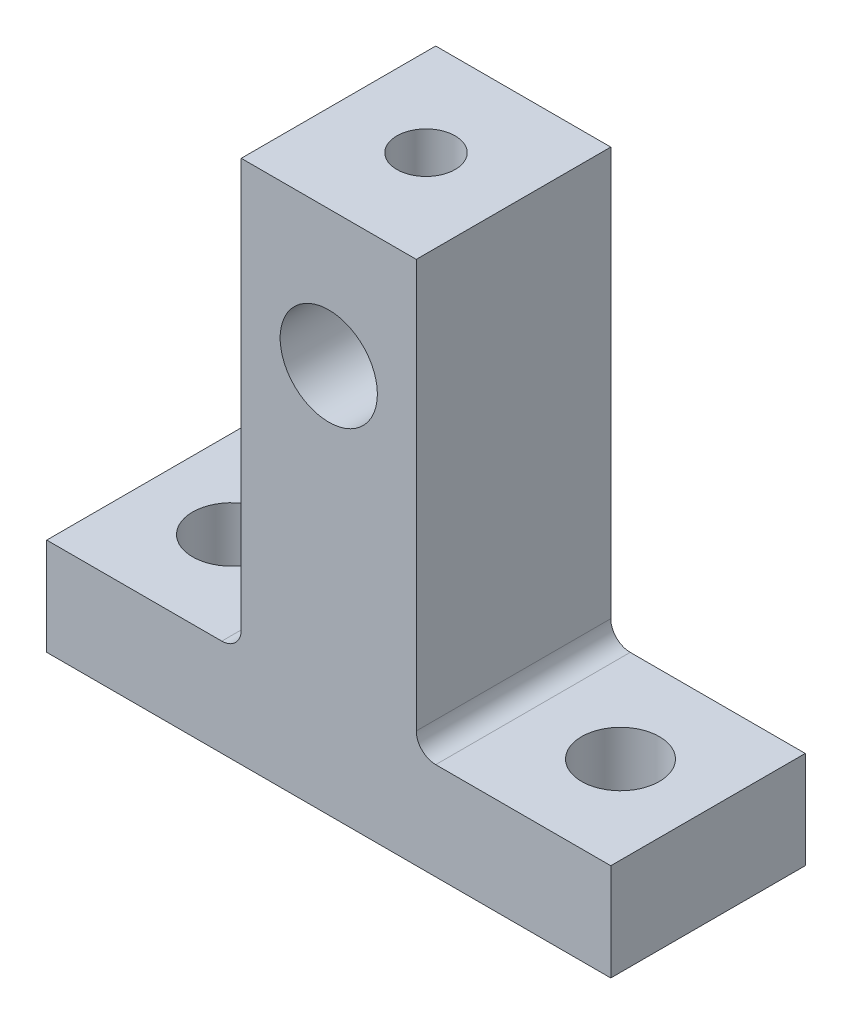
ISO-10303-21;
HEADER;
FILE_DESCRIPTION(('STEP AP214'),'2;1');
FILE_NAME('part.step','',(''),(''),'','','');
FILE_SCHEMA(('AUTOMOTIVE_DESIGN { 1 0 10303 214 1 1 1 1 }'));
ENDSEC;
DATA;
#1=APPLICATION_CONTEXT('core data for automotive mechanical design processes');
#2=APPLICATION_PROTOCOL_DEFINITION('international standard','automotive_design',2000,#1);
#3=PRODUCT_CONTEXT('',#1,'mechanical');
#4=PRODUCT('Part','Part','',(#3));
#5=PRODUCT_RELATED_PRODUCT_CATEGORY('part','',(#4));
#6=PRODUCT_DEFINITION_FORMATION('','',#4);
#7=PRODUCT_DEFINITION_CONTEXT('part definition',#1,'design');
#8=PRODUCT_DEFINITION('design','',#6,#7);
#9=PRODUCT_DEFINITION_SHAPE('','',#8);
#10=(LENGTH_UNIT() NAMED_UNIT(*) SI_UNIT(.MILLI.,.METRE.));
#11=(NAMED_UNIT(*) PLANE_ANGLE_UNIT() SI_UNIT($,.RADIAN.));
#12=(NAMED_UNIT(*) SI_UNIT($,.STERADIAN.) SOLID_ANGLE_UNIT());
#13=UNCERTAINTY_MEASURE_WITH_UNIT(LENGTH_MEASURE(1.E-05),#10,'distance_accuracy_value','');
#14=(GEOMETRIC_REPRESENTATION_CONTEXT(3) GLOBAL_UNCERTAINTY_ASSIGNED_CONTEXT((#13)) GLOBAL_UNIT_ASSIGNED_CONTEXT((#10,
#11,#12)) REPRESENTATION_CONTEXT('',''));
#15=CARTESIAN_POINT('',(0.,0.,0.));
#16=DIRECTION('',(0.,0.,1.));
#17=DIRECTION('',(1.,0.,0.));
#18=AXIS2_PLACEMENT_3D('',#15,#16,#17);
#19=CARTESIAN_POINT('',(20.,6.,5.));
#20=DIRECTION('',(0.,0.,-1.));
#21=DIRECTION('',(-1.,0.,0.));
#22=AXIS2_PLACEMENT_3D('',#19,#20,#21);
#23=PLANE('',#22);
#24=DIRECTION('',(0.,-1.,0.));
#25=VECTOR('',#24,1.);
#26=CARTESIAN_POINT('',(0.,5.,5.));
#27=LINE('',#26,#25);
#28=CARTESIAN_POINT('',(0.,5.,5.));
#29=VERTEX_POINT('',#28);
#30=CARTESIAN_POINT('',(0.,0.,5.));
#31=VERTEX_POINT('',#30);
#32=EDGE_CURVE('E165',#29,#31,#27,.T.);
#33=ORIENTED_EDGE('',*,*,#32,.T.);
#34=DIRECTION('',(1.,0.,0.));
#35=VECTOR('',#34,1.);
#36=CARTESIAN_POINT('',(0.,0.,5.));
#37=LINE('',#36,#35);
#38=CARTESIAN_POINT('',(29.,0.,5.));
#39=VERTEX_POINT('',#38);
#40=EDGE_CURVE('E103',#31,#39,#37,.T.);
#41=ORIENTED_EDGE('',*,*,#40,.T.);
#42=DIRECTION('',(0.,1.,0.));
#43=VECTOR('',#42,1.);
#44=CARTESIAN_POINT('',(29.,0.,5.));
#45=LINE('',#44,#43);
#46=CARTESIAN_POINT('',(29.,5.,5.));
#47=VERTEX_POINT('',#46);
#48=EDGE_CURVE('E186',#39,#47,#45,.T.);
#49=ORIENTED_EDGE('',*,*,#48,.T.);
#50=DIRECTION('',(-1.,0.,0.));
#51=VECTOR('',#50,1.);
#52=CARTESIAN_POINT('',(29.,5.,5.));
#53=LINE('',#52,#51);
#54=CARTESIAN_POINT('',(20.,5.,5.));
#55=VERTEX_POINT('',#54);
#56=EDGE_CURVE('E205',#47,#55,#53,.T.);
#57=ORIENTED_EDGE('',*,*,#56,.T.);
#58=CARTESIAN_POINT('',(20.,6.,5.));
#59=DIRECTION('',(0.,0.,-1.));
#60=DIRECTION('',(-1.,0.,0.));
#61=AXIS2_PLACEMENT_3D('',#58,#59,#60);
#62=CIRCLE('',#61,1.);
#63=CARTESIAN_POINT('',(19.,6.,5.));
#64=VERTEX_POINT('',#63);
#65=EDGE_CURVE('E202',#55,#64,#62,.T.);
#66=ORIENTED_EDGE('',*,*,#65,.T.);
#67=DIRECTION('',(0.,1.,0.));
#68=VECTOR('',#67,1.);
#69=CARTESIAN_POINT('',(19.,6.00000000000001,5.));
#70=LINE('',#69,#68);
#71=CARTESIAN_POINT('',(19.,27.,5.));
#72=VERTEX_POINT('',#71);
#73=EDGE_CURVE('E204',#64,#72,#70,.T.);
#74=ORIENTED_EDGE('',*,*,#73,.T.);
#75=DIRECTION('',(-1.,0.,0.));
#76=VECTOR('',#75,1.);
#77=CARTESIAN_POINT('',(19.,27.,5.));
#78=LINE('',#77,#76);
#79=CARTESIAN_POINT('',(10.,27.,5.));
#80=VERTEX_POINT('',#79);
#81=EDGE_CURVE('E128',#72,#80,#78,.T.);
#82=ORIENTED_EDGE('',*,*,#81,.T.);
#83=DIRECTION('',(0.,-1.,0.));
#84=VECTOR('',#83,1.);
#85=CARTESIAN_POINT('',(10.,27.,5.));
#86=LINE('',#85,#84);
#87=CARTESIAN_POINT('',(10.,6.00000000000001,5.));
#88=VERTEX_POINT('',#87);
#89=EDGE_CURVE('E122',#80,#88,#86,.T.);
#90=ORIENTED_EDGE('',*,*,#89,.T.);
#91=CARTESIAN_POINT('',(9.,6.,5.));
#92=DIRECTION('',(0.,0.,-1.));
#93=DIRECTION('',(-1.,0.,0.));
#94=AXIS2_PLACEMENT_3D('',#91,#92,#93);
#95=CIRCLE('',#94,1.);
#96=CARTESIAN_POINT('',(8.99999999999999,5.,5.));
#97=VERTEX_POINT('',#96);
#98=EDGE_CURVE('E126',#88,#97,#95,.T.);
#99=ORIENTED_EDGE('',*,*,#98,.T.);
#100=DIRECTION('',(-1.,0.,0.));
#101=VECTOR('',#100,1.);
#102=CARTESIAN_POINT('',(8.99999999999999,5.,5.));
#103=LINE('',#102,#101);
#104=EDGE_CURVE('E54',#97,#29,#103,.T.);
#105=ORIENTED_EDGE('',*,*,#104,.T.);
#106=EDGE_LOOP('',(#33,#41,#49,#57,#66,#74,#82,#90,#99,#105));
#107=FACE_BOUND('',#106,.T.);
#108=CARTESIAN_POINT('',(14.5,20.,5.));
#109=DIRECTION('',(0.,0.,1.));
#110=DIRECTION('',(1.,0.,0.));
#111=AXIS2_PLACEMENT_3D('',#108,#109,#110);
#112=CIRCLE('',#111,2.5);
#113=CARTESIAN_POINT('',(17.,20.,5.));
#114=VERTEX_POINT('',#113);
#115=EDGE_CURVE('E150',#114,#114,#112,.T.);
#116=ORIENTED_EDGE('',*,*,#115,.F.);
#117=EDGE_LOOP('',(#116));
#118=FACE_BOUND('',#117,.T.);
#119=ADVANCED_FACE('F37',(#107,#118),#23,.F.);
#120=CARTESIAN_POINT('',(20.,6.,-5.));
#121=DIRECTION('',(0.,0.,-1.));
#122=DIRECTION('',(-1.,0.,0.));
#123=AXIS2_PLACEMENT_3D('',#120,#121,#122);
#124=PLANE('',#123);
#125=DIRECTION('',(0.,-1.,0.));
#126=VECTOR('',#125,1.);
#127=CARTESIAN_POINT('',(0.,5.,-5.));
#128=LINE('',#127,#126);
#129=CARTESIAN_POINT('',(0.,5.,-5.));
#130=VERTEX_POINT('',#129);
#131=CARTESIAN_POINT('',(0.,0.,-5.));
#132=VERTEX_POINT('',#131);
#133=EDGE_CURVE('E146',#130,#132,#128,.T.);
#134=ORIENTED_EDGE('',*,*,#133,.F.);
#135=DIRECTION('',(-1.,0.,0.));
#136=VECTOR('',#135,1.);
#137=CARTESIAN_POINT('',(8.99999999999999,5.,-5.));
#138=LINE('',#137,#136);
#139=CARTESIAN_POINT('',(8.99999999999999,5.,-5.));
#140=VERTEX_POINT('',#139);
#141=EDGE_CURVE('E95',#140,#130,#138,.T.);
#142=ORIENTED_EDGE('',*,*,#141,.F.);
#143=CARTESIAN_POINT('',(9.,6.,-5.));
#144=DIRECTION('',(0.,0.,-1.));
#145=DIRECTION('',(-1.,0.,0.));
#146=AXIS2_PLACEMENT_3D('',#143,#144,#145);
#147=CIRCLE('',#146,1.);
#148=CARTESIAN_POINT('',(10.,6.00000000000001,-5.));
#149=VERTEX_POINT('',#148);
#150=EDGE_CURVE('E89',#149,#140,#147,.T.);
#151=ORIENTED_EDGE('',*,*,#150,.F.);
#152=DIRECTION('',(0.,-1.,0.));
#153=VECTOR('',#152,1.);
#154=CARTESIAN_POINT('',(10.,27.,-5.));
#155=LINE('',#154,#153);
#156=CARTESIAN_POINT('',(10.,27.,-5.));
#157=VERTEX_POINT('',#156);
#158=EDGE_CURVE('E136',#157,#149,#155,.T.);
#159=ORIENTED_EDGE('',*,*,#158,.F.);
#160=DIRECTION('',(-1.,0.,0.));
#161=VECTOR('',#160,1.);
#162=CARTESIAN_POINT('',(19.,27.,-5.));
#163=LINE('',#162,#161);
#164=CARTESIAN_POINT('',(19.,27.,-5.));
#165=VERTEX_POINT('',#164);
#166=EDGE_CURVE('E160',#165,#157,#163,.T.);
#167=ORIENTED_EDGE('',*,*,#166,.F.);
#168=DIRECTION('',(0.,1.,0.));
#169=VECTOR('',#168,1.);
#170=CARTESIAN_POINT('',(19.,6.00000000000001,-5.));
#171=LINE('',#170,#169);
#172=CARTESIAN_POINT('',(19.,6.,-5.));
#173=VERTEX_POINT('',#172);
#174=EDGE_CURVE('E158',#173,#165,#171,.T.);
#175=ORIENTED_EDGE('',*,*,#174,.F.);
#176=CARTESIAN_POINT('',(20.,6.,-5.));
#177=DIRECTION('',(0.,0.,-1.));
#178=DIRECTION('',(-1.,0.,0.));
#179=AXIS2_PLACEMENT_3D('',#176,#177,#178);
#180=CIRCLE('',#179,1.);
#181=CARTESIAN_POINT('',(20.,5.,-5.));
#182=VERTEX_POINT('',#181);
#183=EDGE_CURVE('E156',#182,#173,#180,.T.);
#184=ORIENTED_EDGE('',*,*,#183,.F.);
#185=DIRECTION('',(-1.,0.,0.));
#186=VECTOR('',#185,1.);
#187=CARTESIAN_POINT('',(29.,5.,-5.));
#188=LINE('',#187,#186);
#189=CARTESIAN_POINT('',(29.,5.,-5.));
#190=VERTEX_POINT('',#189);
#191=EDGE_CURVE('E154',#190,#182,#188,.T.);
#192=ORIENTED_EDGE('',*,*,#191,.F.);
#193=DIRECTION('',(0.,1.,0.));
#194=VECTOR('',#193,1.);
#195=CARTESIAN_POINT('',(29.,0.,-5.));
#196=LINE('',#195,#194);
#197=CARTESIAN_POINT('',(29.,0.,-5.));
#198=VERTEX_POINT('',#197);
#199=EDGE_CURVE('E152',#198,#190,#196,.T.);
#200=ORIENTED_EDGE('',*,*,#199,.F.);
#201=DIRECTION('',(1.,0.,0.));
#202=VECTOR('',#201,1.);
#203=CARTESIAN_POINT('',(0.,0.,-5.));
#204=LINE('',#203,#202);
#205=EDGE_CURVE('E149',#132,#198,#204,.T.);
#206=ORIENTED_EDGE('',*,*,#205,.F.);
#207=EDGE_LOOP('',(#134,#142,#151,#159,#167,#175,#184,#192,#200,#206));
#208=FACE_BOUND('',#207,.T.);
#209=CARTESIAN_POINT('',(14.5,20.,-5.));
#210=DIRECTION('',(0.,0.,1.));
#211=DIRECTION('',(1.,0.,0.));
#212=AXIS2_PLACEMENT_3D('',#209,#210,#211);
#213=CIRCLE('',#212,2.5);
#214=CARTESIAN_POINT('',(17.,20.,-5.));
#215=VERTEX_POINT('',#214);
#216=EDGE_CURVE('E213',#215,#215,#213,.T.);
#217=ORIENTED_EDGE('',*,*,#216,.T.);
#218=EDGE_LOOP('',(#217));
#219=FACE_BOUND('',#218,.T.);
#220=ADVANCED_FACE('F190',(#208,#219),#124,.T.);
#221=CARTESIAN_POINT('',(0.,5.,5.));
#222=DIRECTION('',(1.,0.,0.));
#223=DIRECTION('',(0.,1.,0.));
#224=AXIS2_PLACEMENT_3D('',#221,#222,#223);
#225=PLANE('',#224);
#226=ORIENTED_EDGE('',*,*,#133,.T.);
#227=DIRECTION('',(0.,0.,-1.));
#228=VECTOR('',#227,1.);
#229=CARTESIAN_POINT('',(0.,0.,5.));
#230=LINE('',#229,#228);
#231=EDGE_CURVE('E11',#31,#132,#230,.T.);
#232=ORIENTED_EDGE('',*,*,#231,.F.);
#233=ORIENTED_EDGE('',*,*,#32,.F.);
#234=DIRECTION('',(0.,0.,-1.));
#235=VECTOR('',#234,1.);
#236=CARTESIAN_POINT('',(0.,5.,5.));
#237=LINE('',#236,#235);
#238=EDGE_CURVE('E142',#29,#130,#237,.T.);
#239=ORIENTED_EDGE('',*,*,#238,.T.);
#240=EDGE_LOOP('',(#226,#232,#233,#239));
#241=FACE_BOUND('',#240,.T.);
#242=ADVANCED_FACE('F39',(#241),#225,.F.);
#243=CARTESIAN_POINT('',(0.,0.,5.));
#244=DIRECTION('',(0.,1.,0.));
#245=DIRECTION('',(-1.,0.,0.));
#246=AXIS2_PLACEMENT_3D('',#243,#244,#245);
#247=PLANE('',#246);
#248=CARTESIAN_POINT('',(4.5,0.,0.));
#249=DIRECTION('',(0.,1.,0.));
#250=DIRECTION('',(-1.,0.,0.));
#251=AXIS2_PLACEMENT_3D('',#248,#249,#250);
#252=CIRCLE('',#251,2.);
#253=CARTESIAN_POINT('',(2.5,0.,0.));
#254=VERTEX_POINT('',#253);
#255=EDGE_CURVE('E285',#254,#254,#252,.T.);
#256=ORIENTED_EDGE('',*,*,#255,.T.);
#257=EDGE_LOOP('',(#256));
#258=FACE_BOUND('',#257,.T.);
#259=CARTESIAN_POINT('',(24.5,0.,0.));
#260=DIRECTION('',(0.,1.,0.));
#261=DIRECTION('',(-1.,0.,0.));
#262=AXIS2_PLACEMENT_3D('',#259,#260,#261);
#263=CIRCLE('',#262,2.);
#264=CARTESIAN_POINT('',(22.5,0.,0.));
#265=VERTEX_POINT('',#264);
#266=EDGE_CURVE('E288',#265,#265,#263,.T.);
#267=ORIENTED_EDGE('',*,*,#266,.T.);
#268=EDGE_LOOP('',(#267));
#269=FACE_BOUND('',#268,.T.);
#270=ORIENTED_EDGE('',*,*,#205,.T.);
#271=DIRECTION('',(0.,0.,-1.));
#272=VECTOR('',#271,1.);
#273=CARTESIAN_POINT('',(29.,0.,5.));
#274=LINE('',#273,#272);
#275=EDGE_CURVE('E46',#39,#198,#274,.T.);
#276=ORIENTED_EDGE('',*,*,#275,.F.);
#277=ORIENTED_EDGE('',*,*,#40,.F.);
#278=ORIENTED_EDGE('',*,*,#231,.T.);
#279=EDGE_LOOP('',(#270,#276,#277,#278));
#280=FACE_BOUND('',#279,.T.);
#281=ADVANCED_FACE('F276',(#258,#269,#280),#247,.F.);
#282=CARTESIAN_POINT('',(29.,0.,5.));
#283=DIRECTION('',(-1.,0.,0.));
#284=DIRECTION('',(0.,0.,1.));
#285=AXIS2_PLACEMENT_3D('',#282,#283,#284);
#286=PLANE('',#285);
#287=ORIENTED_EDGE('',*,*,#199,.T.);
#288=DIRECTION('',(0.,0.,-1.));
#289=VECTOR('',#288,1.);
#290=CARTESIAN_POINT('',(29.,5.,5.));
#291=LINE('',#290,#289);
#292=EDGE_CURVE('E178',#47,#190,#291,.T.);
#293=ORIENTED_EDGE('',*,*,#292,.F.);
#294=ORIENTED_EDGE('',*,*,#48,.F.);
#295=ORIENTED_EDGE('',*,*,#275,.T.);
#296=EDGE_LOOP('',(#287,#293,#294,#295));
#297=FACE_BOUND('',#296,.T.);
#298=ADVANCED_FACE('F184',(#297),#286,.F.);
#299=CARTESIAN_POINT('',(29.,5.,5.));
#300=DIRECTION('',(0.,-1.,0.));
#301=DIRECTION('',(1.,0.,0.));
#302=AXIS2_PLACEMENT_3D('',#299,#300,#301);
#303=PLANE('',#302);
#304=CARTESIAN_POINT('',(24.5,5.,0.));
#305=DIRECTION('',(0.,1.,0.));
#306=DIRECTION('',(-1.,0.,0.));
#307=AXIS2_PLACEMENT_3D('',#304,#305,#306);
#308=CIRCLE('',#307,2.);
#309=CARTESIAN_POINT('',(22.5,5.,0.));
#310=VERTEX_POINT('',#309);
#311=EDGE_CURVE('E295',#310,#310,#308,.T.);
#312=ORIENTED_EDGE('',*,*,#311,.F.);
#313=EDGE_LOOP('',(#312));
#314=FACE_BOUND('',#313,.T.);
#315=ORIENTED_EDGE('',*,*,#191,.T.);
#316=DIRECTION('',(0.,0.,-1.));
#317=VECTOR('',#316,1.);
#318=CARTESIAN_POINT('',(20.,5.,5.));
#319=LINE('',#318,#317);
#320=EDGE_CURVE('E175',#55,#182,#319,.T.);
#321=ORIENTED_EDGE('',*,*,#320,.F.);
#322=ORIENTED_EDGE('',*,*,#56,.F.);
#323=ORIENTED_EDGE('',*,*,#292,.T.);
#324=EDGE_LOOP('',(#315,#321,#322,#323));
#325=FACE_BOUND('',#324,.T.);
#326=ADVANCED_FACE('F196',(#314,#325),#303,.F.);
#327=CARTESIAN_POINT('',(20.,6.,5.));
#328=DIRECTION('',(0.,0.,-1.));
#329=DIRECTION('',(-1.,0.,0.));
#330=AXIS2_PLACEMENT_3D('',#327,#328,#329);
#331=CYLINDRICAL_SURFACE('',#330,1.);
#332=ORIENTED_EDGE('',*,*,#183,.T.);
#333=DIRECTION('',(0.,0.,-1.));
#334=VECTOR('',#333,1.);
#335=CARTESIAN_POINT('',(19.,6.,5.));
#336=LINE('',#335,#334);
#337=EDGE_CURVE('E172',#64,#173,#336,.T.);
#338=ORIENTED_EDGE('',*,*,#337,.F.);
#339=ORIENTED_EDGE('',*,*,#65,.F.);
#340=ORIENTED_EDGE('',*,*,#320,.T.);
#341=EDGE_LOOP('',(#332,#338,#339,#340));
#342=FACE_BOUND('',#341,.T.);
#343=ADVANCED_FACE('F200',(#342),#331,.F.);
#344=CARTESIAN_POINT('',(19.,6.00000000000001,5.));
#345=DIRECTION('',(-1.,0.,0.));
#346=DIRECTION('',(0.,-1.,0.));
#347=AXIS2_PLACEMENT_3D('',#344,#345,#346);
#348=PLANE('',#347);
#349=ORIENTED_EDGE('',*,*,#174,.T.);
#350=DIRECTION('',(0.,0.,-1.));
#351=VECTOR('',#350,1.);
#352=CARTESIAN_POINT('',(19.,27.,5.));
#353=LINE('',#352,#351);
#354=EDGE_CURVE('E169',#72,#165,#353,.T.);
#355=ORIENTED_EDGE('',*,*,#354,.F.);
#356=ORIENTED_EDGE('',*,*,#73,.F.);
#357=ORIENTED_EDGE('',*,*,#337,.T.);
#358=EDGE_LOOP('',(#349,#355,#356,#357));
#359=FACE_BOUND('',#358,.T.);
#360=ADVANCED_FACE('F265',(#359),#348,.F.);
#361=CARTESIAN_POINT('',(19.,27.,5.));
#362=DIRECTION('',(0.,-1.,0.));
#363=DIRECTION('',(0.,0.,-1.));
#364=AXIS2_PLACEMENT_3D('',#361,#362,#363);
#365=PLANE('',#364);
#366=CARTESIAN_POINT('',(14.5,27.,0.));
#367=DIRECTION('',(0.,1.,0.));
#368=DIRECTION('',(0.,0.,1.));
#369=AXIS2_PLACEMENT_3D('',#366,#367,#368);
#370=CIRCLE('',#369,1.5);
#371=CARTESIAN_POINT('',(14.5,27.,1.5));
#372=VERTEX_POINT('',#371);
#373=EDGE_CURVE('E226',#372,#372,#370,.T.);
#374=ORIENTED_EDGE('',*,*,#373,.F.);
#375=EDGE_LOOP('',(#374));
#376=FACE_BOUND('',#375,.T.);
#377=ORIENTED_EDGE('',*,*,#166,.T.);
#378=DIRECTION('',(0.,0.,-1.));
#379=VECTOR('',#378,1.);
#380=CARTESIAN_POINT('',(10.,27.,5.));
#381=LINE('',#380,#379);
#382=EDGE_CURVE('E137',#80,#157,#381,.T.);
#383=ORIENTED_EDGE('',*,*,#382,.F.);
#384=ORIENTED_EDGE('',*,*,#81,.F.);
#385=ORIENTED_EDGE('',*,*,#354,.T.);
#386=EDGE_LOOP('',(#377,#383,#384,#385));
#387=FACE_BOUND('',#386,.T.);
#388=ADVANCED_FACE('F262',(#376,#387),#365,.F.);
#389=CARTESIAN_POINT('',(10.,27.,5.));
#390=DIRECTION('',(1.,0.,0.));
#391=DIRECTION('',(0.,1.,0.));
#392=AXIS2_PLACEMENT_3D('',#389,#390,#391);
#393=PLANE('',#392);
#394=ORIENTED_EDGE('',*,*,#158,.T.);
#395=DIRECTION('',(0.,0.,-1.));
#396=VECTOR('',#395,1.);
#397=CARTESIAN_POINT('',(10.,6.00000000000001,5.));
#398=LINE('',#397,#396);
#399=EDGE_CURVE('E133',#88,#149,#398,.T.);
#400=ORIENTED_EDGE('',*,*,#399,.F.);
#401=ORIENTED_EDGE('',*,*,#89,.F.);
#402=ORIENTED_EDGE('',*,*,#382,.T.);
#403=EDGE_LOOP('',(#394,#400,#401,#402));
#404=FACE_BOUND('',#403,.T.);
#405=ADVANCED_FACE('F134',(#404),#393,.F.);
#406=CARTESIAN_POINT('',(9.,6.,5.));
#407=DIRECTION('',(0.,0.,-1.));
#408=DIRECTION('',(-1.,0.,0.));
#409=AXIS2_PLACEMENT_3D('',#406,#407,#408);
#410=CYLINDRICAL_SURFACE('',#409,1.);
#411=ORIENTED_EDGE('',*,*,#150,.T.);
#412=DIRECTION('',(0.,0.,-1.));
#413=VECTOR('',#412,1.);
#414=CARTESIAN_POINT('',(8.99999999999999,5.,5.));
#415=LINE('',#414,#413);
#416=EDGE_CURVE('E138',#97,#140,#415,.T.);
#417=ORIENTED_EDGE('',*,*,#416,.F.);
#418=ORIENTED_EDGE('',*,*,#98,.F.);
#419=ORIENTED_EDGE('',*,*,#399,.T.);
#420=EDGE_LOOP('',(#411,#417,#418,#419));
#421=FACE_BOUND('',#420,.T.);
#422=ADVANCED_FACE('F140',(#421),#410,.F.);
#423=CARTESIAN_POINT('',(8.99999999999999,5.,5.));
#424=DIRECTION('',(0.,-1.,0.));
#425=DIRECTION('',(1.,0.,0.));
#426=AXIS2_PLACEMENT_3D('',#423,#424,#425);
#427=PLANE('',#426);
#428=CARTESIAN_POINT('',(4.5,5.,0.));
#429=DIRECTION('',(0.,1.,0.));
#430=DIRECTION('',(-1.,0.,0.));
#431=AXIS2_PLACEMENT_3D('',#428,#429,#430);
#432=CIRCLE('',#431,2.);
#433=CARTESIAN_POINT('',(2.5,5.,0.));
#434=VERTEX_POINT('',#433);
#435=EDGE_CURVE('E294',#434,#434,#432,.T.);
#436=ORIENTED_EDGE('',*,*,#435,.F.);
#437=EDGE_LOOP('',(#436));
#438=FACE_BOUND('',#437,.T.);
#439=ORIENTED_EDGE('',*,*,#141,.T.);
#440=ORIENTED_EDGE('',*,*,#238,.F.);
#441=ORIENTED_EDGE('',*,*,#104,.F.);
#442=ORIENTED_EDGE('',*,*,#416,.T.);
#443=EDGE_LOOP('',(#439,#440,#441,#442));
#444=FACE_BOUND('',#443,.T.);
#445=ADVANCED_FACE('F254',(#438,#444),#427,.F.);
#446=CARTESIAN_POINT('',(14.5,20.,5.));
#447=DIRECTION('',(0.,0.,-1.));
#448=DIRECTION('',(-1.,0.,0.));
#449=AXIS2_PLACEMENT_3D('',#446,#447,#448);
#450=CYLINDRICAL_SURFACE('',#449,2.5);
#451=CARTESIAN_POINT('',(14.5,22.5,1.5));
#452=CARTESIAN_POINT('',(14.576729833462,22.4999962578973,1.49999590899012));
#453=CARTESIAN_POINT('',(14.6535823206442,22.4964290461501,1.49407132907374));
#454=CARTESIAN_POINT('',(14.8049755095307,22.4824990360857,1.47067568048467));
#455=CARTESIAN_POINT('',(14.879510034596,22.4721194803272,1.45317613814578));
#456=CARTESIAN_POINT('',(15.0237518277908,22.4456155805449,1.40761363883314));
#457=CARTESIAN_POINT('',(15.0934810282266,22.4295197327294,1.37960304183684));
#458=CARTESIAN_POINT('',(15.2270303182147,22.3929536762641,1.31413966685897));
#459=CARTESIAN_POINT('',(15.2908518694164,22.3724845538025,1.27668923303126));
#460=CARTESIAN_POINT('',(15.4162992789993,22.3270536071909,1.19022517329142));
#461=CARTESIAN_POINT('',(15.4773840200814,22.3018679219598,1.14054630464861));
#462=CARTESIAN_POINT('',(15.5908827041189,22.2503043927963,1.03253279617173));
#463=CARTESIAN_POINT('',(15.6432853494811,22.2239250515357,0.974187062812685));
#464=CARTESIAN_POINT('',(15.7444499676297,22.1691106699591,0.842076489503271));
#465=CARTESIAN_POINT('',(15.7919776637881,22.1408201770365,0.767298229018715));
#466=CARTESIAN_POINT('',(15.873614377649,22.0893830141212,0.609153426756889));
#467=CARTESIAN_POINT('',(15.9077451733516,22.0662280227394,0.525801103752434));
#468=CARTESIAN_POINT('',(15.9544060171422,22.0335462966093,0.373403549346762));
#469=CARTESIAN_POINT('',(15.9701619724683,22.0220788313759,0.305764001389686));
#470=CARTESIAN_POINT('',(15.9921617234047,22.005903082955,0.168196284169639));
#471=CARTESIAN_POINT('',(15.9984173455683,22.0011863964376,0.0982710712455087));
#472=CARTESIAN_POINT('',(16.0010550879601,21.9992092246386,-0.0420114942173333));
#473=CARTESIAN_POINT('',(15.9974178340842,22.0019633701272,-0.112369425093195));
#474=CARTESIAN_POINT('',(15.9804606047883,22.0145326144374,-0.251278775427585));
#475=CARTESIAN_POINT('',(15.967133346201,22.0243530243223,-0.319828795847442));
#476=CARTESIAN_POINT('',(15.9317392188179,22.0495318694426,-0.452530242128104));
#477=CARTESIAN_POINT('',(15.9097874866609,22.0648171165254,-0.516727053924481));
#478=CARTESIAN_POINT('',(15.8579506177084,22.0992705135083,-0.640694990928121));
#479=CARTESIAN_POINT('',(15.828062572597,22.1184400862346,-0.700464483423924));
#480=CARTESIAN_POINT('',(15.7551798318458,22.1625532726899,-0.824984097122801));
#481=CARTESIAN_POINT('',(15.7108072439772,22.1879204337299,-0.888778092954925));
#482=CARTESIAN_POINT('',(15.61291092784,22.2393059976438,-1.00867648366701));
#483=CARTESIAN_POINT('',(15.5593784510058,22.2653250026215,-1.0647734339765));
#484=CARTESIAN_POINT('',(15.435811834383,22.3193550495832,-1.17561298182176));
#485=CARTESIAN_POINT('',(15.364517682705,22.3471383626853,-1.22907730601599));
#486=CARTESIAN_POINT('',(15.212276050459,22.3977242843398,-1.32312204719791));
#487=CARTESIAN_POINT('',(15.1313337639436,22.4205295542552,-1.36370935378995));
#488=CARTESIAN_POINT('',(14.9671975852682,22.4573039206615,-1.4279321827959));
#489=CARTESIAN_POINT('',(14.8844676241736,22.471739574397,-1.45247535571591));
#490=CARTESIAN_POINT('',(14.7150478951446,22.4921884281355,-1.48701119740538));
#491=CARTESIAN_POINT('',(14.6283630056613,22.4982117295274,-1.49702131775358));
#492=CARTESIAN_POINT('',(14.4662853856226,22.5009057037461,-1.50150784767831));
#493=CARTESIAN_POINT('',(14.3909575265813,22.4987352171429,-1.49790885508517));
#494=CARTESIAN_POINT('',(14.2421705980139,22.4877871208705,-1.47957414692808));
#495=CARTESIAN_POINT('',(14.1687114906239,22.4790096451804,-1.46483865719419));
#496=CARTESIAN_POINT('',(14.0274250678424,22.4559479244219,-1.42545656718754));
#497=CARTESIAN_POINT('',(13.9595042490715,22.4418027566256,-1.40105965092653));
#498=CARTESIAN_POINT('',(13.8287342509127,22.4091388086284,-1.34332262363473));
#499=CARTESIAN_POINT('',(13.7658860750361,22.3906191658651,-1.30998074865333));
#500=CARTESIAN_POINT('',(13.6399937371761,22.3484549623736,-1.2314430207913));
#501=CARTESIAN_POINT('',(13.5776058495432,22.3244780273988,-1.18537617092161));
#502=CARTESIAN_POINT('',(13.4609739686899,22.2747426557473,-1.08460860651139));
#503=CARTESIAN_POINT('',(13.4067395972626,22.2489821658636,-1.02989784514747));
#504=CARTESIAN_POINT('',(13.3006800326442,22.1944542390989,-0.905089609962851));
#505=CARTESIAN_POINT('',(13.2500898036909,22.1657324174629,-0.8339161145345));
#506=CARTESIAN_POINT('',(13.1615476108433,22.1121618206671,-0.682783975431799));
#507=CARTESIAN_POINT('',(13.1235823323022,22.0873089799769,-0.602834706107218));
#508=CARTESIAN_POINT('',(13.0685742120422,22.0498490924052,-0.453756977693314));
#509=CARTESIAN_POINT('',(13.0487837466381,22.0357565932873,-0.386019687641414));
#510=CARTESIAN_POINT('',(13.0188633609403,22.0140960574354,-0.247467921919899));
#511=CARTESIAN_POINT('',(13.0087200470237,22.0065189764272,-0.176657855672176));
#512=CARTESIAN_POINT('',(12.9986586958337,21.9990044661627,-0.0336230524029716));
#513=CARTESIAN_POINT('',(12.9987791089213,21.9990957644594,0.0386059906870393));
#514=CARTESIAN_POINT('',(13.0093352704067,22.0069771789285,0.181894435609455));
#515=CARTESIAN_POINT('',(13.0197766278424,22.0147714813882,0.252953180080591));
#516=CARTESIAN_POINT('',(13.0495982585109,22.0363318524298,0.388488417572182));
#517=CARTESIAN_POINT('',(13.0685236315465,22.0497921180558,0.453117094306868));
#518=CARTESIAN_POINT('',(13.1143675792301,22.0810550196015,0.578337254474213));
#519=CARTESIAN_POINT('',(13.1412891641152,22.0988592904048,0.638927206960549));
#520=CARTESIAN_POINT('',(13.2071075444427,22.1401299055092,0.764319857220775));
#521=CARTESIAN_POINT('',(13.2472083232425,22.1640458758264,0.828341103854303));
#522=CARTESIAN_POINT('',(13.3362430161091,22.2132012703077,0.949380072617285));
#523=CARTESIAN_POINT('',(13.385184203922,22.2384417720502,1.00639196215255));
#524=CARTESIAN_POINT('',(13.4999022257426,22.2922569029148,1.12135094913167));
#525=CARTESIAN_POINT('',(13.5671231806861,22.3207030866366,1.17793107489618));
#526=CARTESIAN_POINT('',(13.7115375655544,22.3736542887237,1.2790978558633));
#527=CARTESIAN_POINT('',(13.7887345554984,22.3981578931094,1.32368021198479));
#528=CARTESIAN_POINT('',(13.9488747691985,22.4398557865439,1.39778580757373));
#529=CARTESIAN_POINT('',(14.0315699130428,22.4572507747979,1.42772806492683));
#530=CARTESIAN_POINT('',(14.2020266938812,22.4836627300125,1.47272469521097));
#531=CARTESIAN_POINT('',(14.2897679003514,22.4927112587148,1.48783516785699));
#532=CARTESIAN_POINT('',(14.3984419030825,22.4980200116819,1.49669745470866));
#533=CARTESIAN_POINT('',(14.4187237409717,22.4987611465636,1.4979344173061));
#534=CARTESIAN_POINT('',(14.4593341793129,22.4997516451737,1.49958624637086));
#535=CARTESIAN_POINT('',(14.4796627813624,22.5000009918432,1.5000010843209));
#536=CARTESIAN_POINT('',(14.5,22.5,1.5));
#537=B_SPLINE_CURVE_WITH_KNOTS('',3,(#451,#452,#453,#454,#455,#456,#457,#458,#459,#460,#461,
#462,#463,#464,#465,#466,#467,#468,#469,#470,#471,#472,#473,#474,#475,#476,#477,#478,#479,#480,
#481,#482,#483,#484,#485,#486,#487,#488,#489,#490,#491,#492,#493,#494,#495,#496,#497,#498,#499,
#500,#501,#502,#503,#504,#505,#506,#507,#508,#509,#510,#511,#512,#513,#514,#515,#516,#517,#518,
#519,#520,#521,#522,#523,#524,#525,#526,#527,#528,#529,#530,#531,#532,#533,#534,#535,#536),
.UNSPECIFIED.,.T.,.F.,(4,2,2,2,2,2,2,2,2,2,2,2,2,2,2,2,2,2,2,2,2,2,2,2,2,2,2,2,2,2,2,2,2,2,2,2,
2,2,2,2,2,2,4),(0.,0.230102237548648,0.460772627520011,0.690308884600009,0.919788197992274,
1.16681590732472,1.414162579348,1.69183813189807,1.96906040692091,2.17933829855633,
2.38935420916578,2.59978170870726,2.81036753273872,3.01823267593207,3.22617409809868,
3.47046995225162,3.71500044803674,3.99360957884691,4.27206939275324,4.53296790696559,
4.79355286918236,5.01875602722426,5.24395461863455,5.46367785689772,5.68344445659025,
5.92601365818362,6.16886690081836,6.44336762428009,6.71757792616456,6.93257787314692,
7.14727888733318,7.36278425777433,7.57840681155725,7.78364098331142,7.98895251523035,
8.22578610052286,8.46281544370207,8.73854311775518,9.01436946031985,9.28175654462677,
9.54812832184448,9.60911473335177,9.67010326027641),.UNSPECIFIED.);
#538=CARTESIAN_POINT('',(14.5,22.5,1.5));
#539=VERTEX_POINT('',#538);
#540=EDGE_CURVE('E216',#539,#539,#537,.T.);
#541=ORIENTED_EDGE('',*,*,#540,.T.);
#542=EDGE_LOOP('',(#541));
#543=FACE_BOUND('',#542,.T.);
#544=ORIENTED_EDGE('',*,*,#115,.T.);
#545=EDGE_LOOP('',(#544));
#546=FACE_BOUND('',#545,.T.);
#547=ORIENTED_EDGE('',*,*,#216,.F.);
#548=EDGE_LOOP('',(#547));
#549=FACE_BOUND('',#548,.T.);
#550=ADVANCED_FACE('F243',(#543,#546,#549),#450,.F.);
#551=CARTESIAN_POINT('',(14.5,-0.001000000000001,0.));
#552=DIRECTION('',(0.,1.,0.));
#553=DIRECTION('',(0.,0.,1.));
#554=AXIS2_PLACEMENT_3D('',#551,#552,#553);
#555=CYLINDRICAL_SURFACE('',#554,1.5);
#556=ORIENTED_EDGE('',*,*,#373,.T.);
#557=EDGE_LOOP('',(#556));
#558=FACE_BOUND('',#557,.T.);
#559=ORIENTED_EDGE('',*,*,#540,.F.);
#560=EDGE_LOOP('',(#559));
#561=FACE_BOUND('',#560,.T.);
#562=ADVANCED_FACE('F228',(#558,#561),#555,.F.);
#563=CARTESIAN_POINT('',(4.5,0.,0.));
#564=DIRECTION('',(0.,1.,0.));
#565=DIRECTION('',(-1.,0.,0.));
#566=AXIS2_PLACEMENT_3D('',#563,#564,#565);
#567=CYLINDRICAL_SURFACE('',#566,2.);
#568=ORIENTED_EDGE('',*,*,#255,.F.);
#569=EDGE_LOOP('',(#568));
#570=FACE_BOUND('',#569,.T.);
#571=ORIENTED_EDGE('',*,*,#435,.T.);
#572=EDGE_LOOP('',(#571));
#573=FACE_BOUND('',#572,.T.);
#574=ADVANCED_FACE('F236',(#570,#573),#567,.F.);
#575=CARTESIAN_POINT('',(24.5,0.,0.));
#576=DIRECTION('',(0.,1.,0.));
#577=DIRECTION('',(-1.,0.,0.));
#578=AXIS2_PLACEMENT_3D('',#575,#576,#577);
#579=CYLINDRICAL_SURFACE('',#578,2.);
#580=ORIENTED_EDGE('',*,*,#266,.F.);
#581=EDGE_LOOP('',(#580));
#582=FACE_BOUND('',#581,.T.);
#583=ORIENTED_EDGE('',*,*,#311,.T.);
#584=EDGE_LOOP('',(#583));
#585=FACE_BOUND('',#584,.T.);
#586=ADVANCED_FACE('F233',(#582,#585),#579,.F.);
#587=CLOSED_SHELL('',(#119,#220,#242,#281,#298,#326,#343,#360,#388,#405,#422,#445,#550,#562,
#574,#586));
#588=MANIFOLD_SOLID_BREP('B2',#587);
#589=ADVANCED_BREP_SHAPE_REPRESENTATION('',(#18,#588),#14);
#590=SHAPE_DEFINITION_REPRESENTATION(#9,#589);
ENDSEC;
END-ISO-10303-21;
